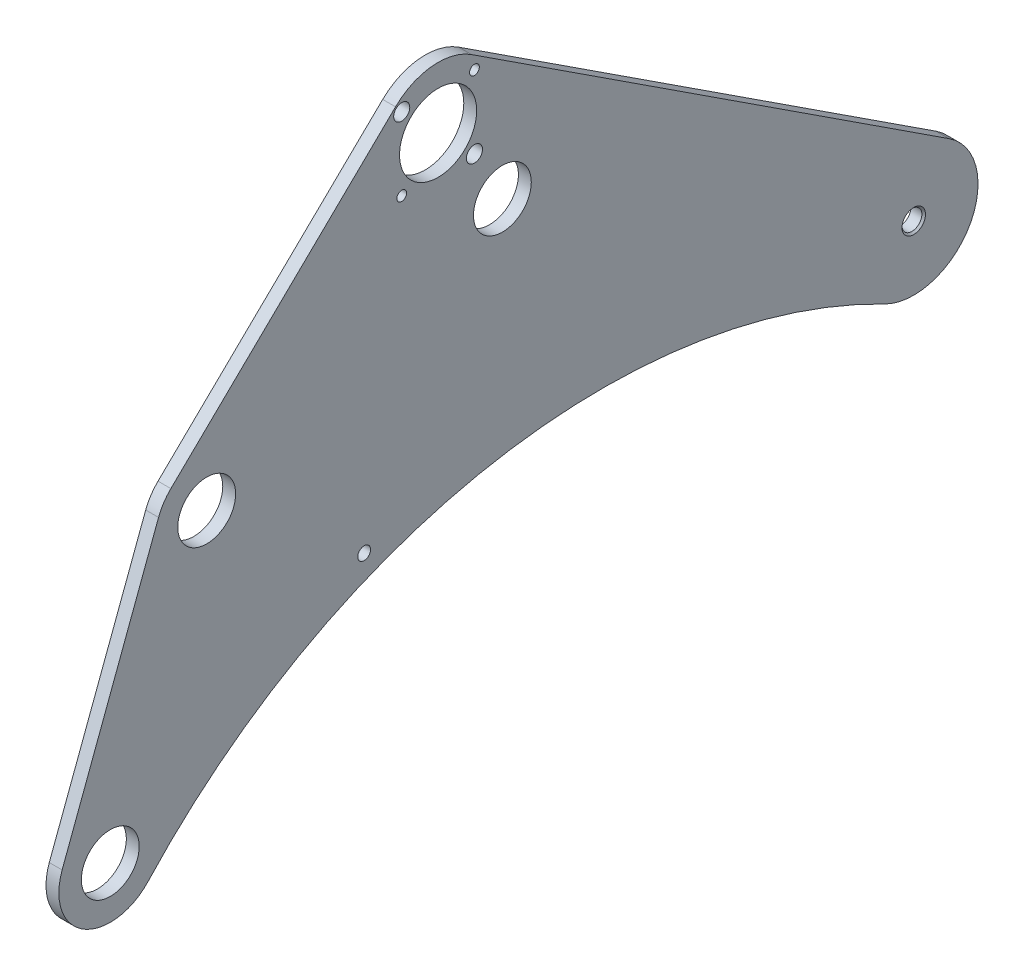
ISO-10303-21;
HEADER;
FILE_DESCRIPTION(('STEP AP214'),'2;1');
FILE_NAME('part.step','',(''),(''),'','','');
FILE_SCHEMA(('AUTOMOTIVE_DESIGN { 1 0 10303 214 1 1 1 1 }'));
ENDSEC;
DATA;
#1=APPLICATION_CONTEXT('core data for automotive mechanical design processes');
#2=APPLICATION_PROTOCOL_DEFINITION('international standard','automotive_design',2000,#1);
#3=PRODUCT_CONTEXT('',#1,'mechanical');
#4=PRODUCT('Part','Part','',(#3));
#5=PRODUCT_RELATED_PRODUCT_CATEGORY('part','',(#4));
#6=PRODUCT_DEFINITION_FORMATION('','',#4);
#7=PRODUCT_DEFINITION_CONTEXT('part definition',#1,'design');
#8=PRODUCT_DEFINITION('design','',#6,#7);
#9=PRODUCT_DEFINITION_SHAPE('','',#8);
#10=(LENGTH_UNIT() NAMED_UNIT(*) SI_UNIT(.MILLI.,.METRE.));
#11=(NAMED_UNIT(*) PLANE_ANGLE_UNIT() SI_UNIT($,.RADIAN.));
#12=(NAMED_UNIT(*) SI_UNIT($,.STERADIAN.) SOLID_ANGLE_UNIT());
#13=UNCERTAINTY_MEASURE_WITH_UNIT(LENGTH_MEASURE(1.E-05),#10,'distance_accuracy_value','');
#14=(GEOMETRIC_REPRESENTATION_CONTEXT(3) GLOBAL_UNCERTAINTY_ASSIGNED_CONTEXT((#13)) GLOBAL_UNIT_ASSIGNED_CONTEXT((#10,
#11,#12)) REPRESENTATION_CONTEXT('',''));
#15=CARTESIAN_POINT('',(0.,0.,0.));
#16=DIRECTION('',(0.,0.,1.));
#17=DIRECTION('',(1.,0.,0.));
#18=AXIS2_PLACEMENT_3D('',#15,#16,#17);
#19=CARTESIAN_POINT('',(6.35,0.,0.));
#20=DIRECTION('',(-1.,0.,0.));
#21=DIRECTION('',(0.,0.,1.));
#22=AXIS2_PLACEMENT_3D('',#19,#20,#21);
#23=CYLINDRICAL_SURFACE('',#22,31.75);
#24=CARTESIAN_POINT('',(0.,0.,0.));
#25=DIRECTION('',(1.,0.,0.));
#26=DIRECTION('',(0.,0.,-1.));
#27=AXIS2_PLACEMENT_3D('',#24,#25,#26);
#28=CIRCLE('',#27,31.75);
#29=CARTESIAN_POINT('',(0.,-28.250874568147,14.4896717055573));
#30=VERTEX_POINT('',#29);
#31=CARTESIAN_POINT('',(0.,26.5905001953675,-17.3495763452644));
#32=VERTEX_POINT('',#31);
#33=EDGE_CURVE('E129',#30,#32,#28,.T.);
#34=ORIENTED_EDGE('',*,*,#33,.T.);
#35=DIRECTION('',(-1.,0.,0.));
#36=VECTOR('',#35,1.);
#37=CARTESIAN_POINT('',(6.35,26.5905001953675,-17.3495763452644));
#38=LINE('',#37,#36);
#39=CARTESIAN_POINT('',(6.35,26.5905001953675,-17.3495763452644));
#40=VERTEX_POINT('',#39);
#41=EDGE_CURVE('E11',#40,#32,#38,.T.);
#42=ORIENTED_EDGE('',*,*,#41,.F.);
#43=CARTESIAN_POINT('',(6.35,0.,0.));
#44=DIRECTION('',(1.,0.,0.));
#45=DIRECTION('',(0.,0.,-1.));
#46=AXIS2_PLACEMENT_3D('',#43,#44,#45);
#47=CIRCLE('',#46,31.75);
#48=CARTESIAN_POINT('',(6.35,-28.250874568147,14.4896717055573));
#49=VERTEX_POINT('',#48);
#50=EDGE_CURVE('E144',#49,#40,#47,.T.);
#51=ORIENTED_EDGE('',*,*,#50,.F.);
#52=DIRECTION('',(-1.,0.,0.));
#53=VECTOR('',#52,1.);
#54=CARTESIAN_POINT('',(6.35,-28.250874568147,14.4896717055573));
#55=LINE('',#54,#53);
#56=EDGE_CURVE('E125',#49,#30,#55,.T.);
#57=ORIENTED_EDGE('',*,*,#56,.T.);
#58=EDGE_LOOP('',(#34,#42,#51,#57));
#59=FACE_BOUND('',#58,.T.);
#60=ADVANCED_FACE('F33',(#59),#23,.T.);
#61=CARTESIAN_POINT('',(6.35,180.454975185599,218.467902471999));
#62=DIRECTION('',(0.,-0.837496069145435,0.546443349457147));
#63=DIRECTION('',(0.,-0.546443349457147,-0.837496069145435));
#64=AXIS2_PLACEMENT_3D('',#61,#62,#63);
#65=PLANE('',#64);
#66=DIRECTION('',(0.,0.546443349457147,0.837496069145435));
#67=VECTOR('',#66,1.);
#68=CARTESIAN_POINT('',(0.,180.454975185599,218.467902471999));
#69=LINE('',#68,#67);
#70=CARTESIAN_POINT('',(0.,180.454975185599,218.467902471999));
#71=VERTEX_POINT('',#70);
#72=EDGE_CURVE('E132',#32,#71,#69,.T.);
#73=ORIENTED_EDGE('',*,*,#72,.T.);
#74=DIRECTION('',(-1.,0.,0.));
#75=VECTOR('',#74,1.);
#76=CARTESIAN_POINT('',(6.35,180.454975185599,218.467902471999));
#77=LINE('',#76,#75);
#78=CARTESIAN_POINT('',(6.35,180.454975185599,218.467902471999));
#79=VERTEX_POINT('',#78);
#80=EDGE_CURVE('E41',#79,#71,#77,.T.);
#81=ORIENTED_EDGE('',*,*,#80,.F.);
#82=DIRECTION('',(0.,0.546443349457147,0.837496069145435));
#83=VECTOR('',#82,1.);
#84=CARTESIAN_POINT('',(6.35,180.454975185599,218.467902471999));
#85=LINE('',#84,#83);
#86=EDGE_CURVE('E92',#40,#79,#85,.T.);
#87=ORIENTED_EDGE('',*,*,#86,.F.);
#88=ORIENTED_EDGE('',*,*,#41,.T.);
#89=EDGE_LOOP('',(#73,#81,#87,#88));
#90=FACE_BOUND('',#89,.T.);
#91=ADVANCED_FACE('F279',(#90),#65,.F.);
#92=CARTESIAN_POINT('',(6.35,155.194,234.95));
#93=DIRECTION('',(-1.,0.,0.));
#94=DIRECTION('',(0.,0.,1.));
#95=AXIS2_PLACEMENT_3D('',#92,#93,#94);
#96=CYLINDRICAL_SURFACE('',#95,30.1625);
#97=CARTESIAN_POINT('',(0.,155.194,234.95));
#98=DIRECTION('',(1.,0.,0.));
#99=DIRECTION('',(0.,0.,-1.));
#100=AXIS2_PLACEMENT_3D('',#97,#98,#99);
#101=CIRCLE('',#100,30.1625);
#102=CARTESIAN_POINT('',(0.,176.828999095109,255.966736673533));
#103=VERTEX_POINT('',#102);
#104=EDGE_CURVE('E135',#71,#103,#101,.T.);
#105=ORIENTED_EDGE('',*,*,#104,.T.);
#106=DIRECTION('',(-1.,0.,0.));
#107=VECTOR('',#106,1.);
#108=CARTESIAN_POINT('',(6.35,176.828999095109,255.966736673533));
#109=LINE('',#108,#107);
#110=CARTESIAN_POINT('',(6.35,176.828999095109,255.966736673533));
#111=VERTEX_POINT('',#110);
#112=EDGE_CURVE('E151',#111,#103,#109,.T.);
#113=ORIENTED_EDGE('',*,*,#112,.F.);
#114=CARTESIAN_POINT('',(6.35,155.194,234.95));
#115=DIRECTION('',(1.,0.,0.));
#116=DIRECTION('',(0.,0.,-1.));
#117=AXIS2_PLACEMENT_3D('',#114,#115,#116);
#118=CIRCLE('',#117,30.1625);
#119=EDGE_CURVE('E159',#79,#111,#118,.T.);
#120=ORIENTED_EDGE('',*,*,#119,.F.);
#121=ORIENTED_EDGE('',*,*,#80,.T.);
#122=EDGE_LOOP('',(#105,#113,#120,#121));
#123=FACE_BOUND('',#122,.T.);
#124=ADVANCED_FACE('F157',(#123),#96,.T.);
#125=CARTESIAN_POINT('',(6.35,69.0189466064077,366.948304567186));
#126=DIRECTION('',(0.,-0.717281362456996,-0.696783644377389));
#127=DIRECTION('',(0.,0.696783644377389,-0.717281362456996));
#128=AXIS2_PLACEMENT_3D('',#125,#126,#127);
#129=PLANE('',#128);
#130=DIRECTION('',(0.,-0.696783644377389,0.717281362456996));
#131=VECTOR('',#130,1.);
#132=CARTESIAN_POINT('',(0.,69.0189466064077,366.948304567186));
#133=LINE('',#132,#131);
#134=CARTESIAN_POINT('',(0.,69.0189466064077,366.948304567186));
#135=VERTEX_POINT('',#134);
#136=EDGE_CURVE('E137',#103,#135,#133,.T.);
#137=ORIENTED_EDGE('',*,*,#136,.T.);
#138=DIRECTION('',(-1.,0.,0.));
#139=VECTOR('',#138,1.);
#140=CARTESIAN_POINT('',(6.35,69.0189466064077,366.948304567186));
#141=LINE('',#140,#139);
#142=CARTESIAN_POINT('',(6.35,69.0189466064077,366.948304567186));
#143=VERTEX_POINT('',#142);
#144=EDGE_CURVE('E148',#143,#135,#141,.T.);
#145=ORIENTED_EDGE('',*,*,#144,.F.);
#146=DIRECTION('',(0.,-0.696783644377389,0.717281362456996));
#147=VECTOR('',#146,1.);
#148=CARTESIAN_POINT('',(6.35,69.0189466064077,366.948304567186));
#149=LINE('',#148,#147);
#150=EDGE_CURVE('E171',#111,#143,#149,.T.);
#151=ORIENTED_EDGE('',*,*,#150,.F.);
#152=ORIENTED_EDGE('',*,*,#112,.T.);
#153=EDGE_LOOP('',(#137,#145,#151,#152));
#154=FACE_BOUND('',#153,.T.);
#155=ADVANCED_FACE('F167',(#154),#129,.F.);
#156=CARTESIAN_POINT('',(6.35,50.8,349.25));
#157=DIRECTION('',(-1.,0.,0.));
#158=DIRECTION('',(0.,0.,1.));
#159=AXIS2_PLACEMENT_3D('',#156,#157,#158);
#160=CYLINDRICAL_SURFACE('',#159,25.3999999999999);
#161=CARTESIAN_POINT('',(0.,50.8,349.25));
#162=DIRECTION('',(1.,0.,0.));
#163=DIRECTION('',(0.,0.,-1.));
#164=AXIS2_PLACEMENT_3D('',#161,#162,#163);
#165=CIRCLE('',#164,25.3999999999999);
#166=CARTESIAN_POINT('',(0.,59.7185354163451,373.032761110254));
#167=VERTEX_POINT('',#166);
#168=EDGE_CURVE('E139',#135,#167,#165,.T.);
#169=ORIENTED_EDGE('',*,*,#168,.T.);
#170=DIRECTION('',(-1.,0.,0.));
#171=VECTOR('',#170,1.);
#172=CARTESIAN_POINT('',(6.35,59.7185354163451,373.032761110254));
#173=LINE('',#172,#171);
#174=CARTESIAN_POINT('',(6.35,59.7185354163451,373.032761110254));
#175=VERTEX_POINT('',#174);
#176=EDGE_CURVE('E120',#175,#167,#173,.T.);
#177=ORIENTED_EDGE('',*,*,#176,.F.);
#178=CARTESIAN_POINT('',(6.35,50.8,349.25));
#179=DIRECTION('',(1.,0.,0.));
#180=DIRECTION('',(0.,0.,-1.));
#181=AXIS2_PLACEMENT_3D('',#178,#179,#180);
#182=CIRCLE('',#181,25.3999999999999);
#183=EDGE_CURVE('E111',#143,#175,#182,.T.);
#184=ORIENTED_EDGE('',*,*,#183,.F.);
#185=ORIENTED_EDGE('',*,*,#144,.T.);
#186=EDGE_LOOP('',(#169,#177,#184,#185));
#187=FACE_BOUND('',#186,.T.);
#188=ADVANCED_FACE('F170',(#187),#160,.T.);
#189=CARTESIAN_POINT('',(6.35,-67.2814645836549,420.657761110254));
#190=DIRECTION('',(0.,-0.351123441588392,-0.936329177569044));
#191=DIRECTION('',(0.,0.936329177569045,-0.351123441588392));
#192=AXIS2_PLACEMENT_3D('',#189,#190,#191);
#193=PLANE('',#192);
#194=DIRECTION('',(0.,-0.936329177569045,0.351123441588392));
#195=VECTOR('',#194,1.);
#196=CARTESIAN_POINT('',(0.,-67.2814645836549,420.657761110254));
#197=LINE('',#196,#195);
#198=CARTESIAN_POINT('',(0.,-67.2814645836549,420.657761110254));
#199=VERTEX_POINT('',#198);
#200=EDGE_CURVE('E119',#167,#199,#197,.T.);
#201=ORIENTED_EDGE('',*,*,#200,.T.);
#202=DIRECTION('',(-1.,0.,0.));
#203=VECTOR('',#202,1.);
#204=CARTESIAN_POINT('',(6.35,-67.2814645836549,420.657761110254));
#205=LINE('',#204,#203);
#206=CARTESIAN_POINT('',(6.35,-67.2814645836549,420.657761110254));
#207=VERTEX_POINT('',#206);
#208=EDGE_CURVE('E116',#207,#199,#205,.T.);
#209=ORIENTED_EDGE('',*,*,#208,.F.);
#210=DIRECTION('',(0.,-0.936329177569045,0.351123441588392));
#211=VECTOR('',#210,1.);
#212=CARTESIAN_POINT('',(6.35,-67.2814645836549,420.657761110254));
#213=LINE('',#212,#211);
#214=EDGE_CURVE('E105',#175,#207,#213,.T.);
#215=ORIENTED_EDGE('',*,*,#214,.F.);
#216=ORIENTED_EDGE('',*,*,#176,.T.);
#217=EDGE_LOOP('',(#201,#209,#215,#216));
#218=FACE_BOUND('',#217,.T.);
#219=ADVANCED_FACE('F117',(#218),#193,.F.);
#220=CARTESIAN_POINT('',(6.35,-76.2,396.875));
#221=DIRECTION('',(-1.,0.,0.));
#222=DIRECTION('',(0.,0.,1.));
#223=AXIS2_PLACEMENT_3D('',#220,#221,#222);
#224=CYLINDRICAL_SURFACE('',#223,25.4);
#225=CARTESIAN_POINT('',(0.,-76.2,396.875));
#226=DIRECTION('',(1.,0.,0.));
#227=DIRECTION('',(0.,0.,-1.));
#228=AXIS2_PLACEMENT_3D('',#225,#226,#227);
#229=CIRCLE('',#228,25.4);
#230=CARTESIAN_POINT('',(0.,-93.373790032489,378.160809236839));
#231=VERTEX_POINT('',#230);
#232=EDGE_CURVE('E78',#199,#231,#229,.T.);
#233=ORIENTED_EDGE('',*,*,#232,.T.);
#234=DIRECTION('',(-1.,0.,0.));
#235=VECTOR('',#234,1.);
#236=CARTESIAN_POINT('',(6.35,-93.373790032489,378.160809236839));
#237=LINE('',#236,#235);
#238=CARTESIAN_POINT('',(6.35,-93.373790032489,378.160809236839));
#239=VERTEX_POINT('',#238);
#240=EDGE_CURVE('E121',#239,#231,#237,.T.);
#241=ORIENTED_EDGE('',*,*,#240,.F.);
#242=CARTESIAN_POINT('',(6.35,-76.2,396.875));
#243=DIRECTION('',(1.,0.,0.));
#244=DIRECTION('',(0.,0.,-1.));
#245=AXIS2_PLACEMENT_3D('',#242,#243,#244);
#246=CIRCLE('',#245,25.4);
#247=EDGE_CURVE('E109',#207,#239,#246,.T.);
#248=ORIENTED_EDGE('',*,*,#247,.F.);
#249=ORIENTED_EDGE('',*,*,#208,.T.);
#250=EDGE_LOOP('',(#233,#241,#248,#249));
#251=FACE_BOUND('',#250,.T.);
#252=ADVANCED_FACE('F123',(#251),#224,.T.);
#253=CARTESIAN_POINT('',(6.35,-299.459270422358,153.590520078907));
#254=DIRECTION('',(-1.,0.,0.));
#255=DIRECTION('',(0.,0.,1.));
#256=AXIS2_PLACEMENT_3D('',#253,#254,#255);
#257=CYLINDRICAL_SURFACE('',#256,304.8);
#258=CARTESIAN_POINT('',(0.,-299.459270422358,153.590520078907));
#259=DIRECTION('',(-1.,0.,0.));
#260=DIRECTION('',(0.,0.,1.));
#261=AXIS2_PLACEMENT_3D('',#258,#259,#260);
#262=CIRCLE('',#261,304.8);
#263=EDGE_CURVE('E84',#231,#30,#262,.T.);
#264=ORIENTED_EDGE('',*,*,#263,.T.);
#265=ORIENTED_EDGE('',*,*,#56,.F.);
#266=CARTESIAN_POINT('',(6.35,-299.459270422358,153.590520078907));
#267=DIRECTION('',(-1.,0.,0.));
#268=DIRECTION('',(0.,0.,1.));
#269=AXIS2_PLACEMENT_3D('',#266,#267,#268);
#270=CIRCLE('',#269,304.8);
#271=EDGE_CURVE('E49',#239,#49,#270,.T.);
#272=ORIENTED_EDGE('',*,*,#271,.F.);
#273=ORIENTED_EDGE('',*,*,#240,.T.);
#274=EDGE_LOOP('',(#264,#265,#272,#273));
#275=FACE_BOUND('',#274,.T.);
#276=ADVANCED_FACE('F244',(#275),#257,.F.);
#277=CARTESIAN_POINT('',(6.35,0.,0.));
#278=DIRECTION('',(1.,0.,0.));
#279=DIRECTION('',(0.,0.,-1.));
#280=AXIS2_PLACEMENT_3D('',#277,#278,#279);
#281=PLANE('',#280);
#282=CARTESIAN_POINT('',(6.35,-6.35,271.4625));
#283=DIRECTION('',(1.,0.,0.));
#284=DIRECTION('',(0.,0.,-1.));
#285=AXIS2_PLACEMENT_3D('',#282,#283,#284);
#286=CIRCLE('',#285,3.175);
#287=CARTESIAN_POINT('',(6.35,-6.35,268.2875));
#288=VERTEX_POINT('',#287);
#289=EDGE_CURVE('E236',#288,#288,#286,.T.);
#290=ORIENTED_EDGE('',*,*,#289,.F.);
#291=EDGE_LOOP('',(#290));
#292=FACE_BOUND('',#291,.T.);
#293=CARTESIAN_POINT('',(6.35,0.,0.));
#294=DIRECTION('',(1.,0.,0.));
#295=DIRECTION('',(0.,0.,-1.));
#296=AXIS2_PLACEMENT_3D('',#293,#294,#295);
#297=CIRCLE('',#296,5.79374);
#298=CARTESIAN_POINT('',(6.35,0.,-5.79374));
#299=VERTEX_POINT('',#298);
#300=EDGE_CURVE('E230',#299,#299,#297,.T.);
#301=ORIENTED_EDGE('',*,*,#300,.F.);
#302=EDGE_LOOP('',(#301));
#303=FACE_BOUND('',#302,.T.);
#304=CARTESIAN_POINT('',(6.35,50.8,349.25));
#305=DIRECTION('',(1.,0.,0.));
#306=DIRECTION('',(0.,0.,-1.));
#307=AXIS2_PLACEMENT_3D('',#304,#305,#306);
#308=CIRCLE('',#307,14.2875);
#309=CARTESIAN_POINT('',(6.35,50.8,334.9625));
#310=VERTEX_POINT('',#309);
#311=EDGE_CURVE('E200',#310,#310,#308,.T.);
#312=ORIENTED_EDGE('',*,*,#311,.F.);
#313=EDGE_LOOP('',(#312));
#314=FACE_BOUND('',#313,.T.);
#315=CARTESIAN_POINT('',(6.35,-76.2,396.875));
#316=DIRECTION('',(1.,0.,0.));
#317=DIRECTION('',(0.,0.,-1.));
#318=AXIS2_PLACEMENT_3D('',#315,#316,#317);
#319=CIRCLE('',#318,14.2875);
#320=CARTESIAN_POINT('',(6.35,-76.2,382.5875));
#321=VERTEX_POINT('',#320);
#322=EDGE_CURVE('E186',#321,#321,#319,.T.);
#323=ORIENTED_EDGE('',*,*,#322,.F.);
#324=EDGE_LOOP('',(#323));
#325=FACE_BOUND('',#324,.T.);
#326=CARTESIAN_POINT('',(6.35,137.233487757862,252.910512242138));
#327=DIRECTION('',(1.,0.,0.));
#328=DIRECTION('',(0.,0.,-1.));
#329=AXIS2_PLACEMENT_3D('',#326,#327,#328);
#330=CIRCLE('',#329,2.41300000000034);
#331=CARTESIAN_POINT('',(6.35,137.233487757862,250.497512242138));
#332=VERTEX_POINT('',#331);
#333=EDGE_CURVE('E193',#332,#332,#330,.T.);
#334=ORIENTED_EDGE('',*,*,#333,.F.);
#335=EDGE_LOOP('',(#334));
#336=FACE_BOUND('',#335,.T.);
#337=CARTESIAN_POINT('',(6.35,155.194,234.95));
#338=DIRECTION('',(1.,0.,0.));
#339=DIRECTION('',(0.,0.,-1.));
#340=AXIS2_PLACEMENT_3D('',#337,#338,#339);
#341=CIRCLE('',#340,19.05);
#342=CARTESIAN_POINT('',(6.35,155.194,215.9));
#343=VERTEX_POINT('',#342);
#344=EDGE_CURVE('E187',#343,#343,#341,.T.);
#345=ORIENTED_EDGE('',*,*,#344,.F.);
#346=EDGE_LOOP('',(#345));
#347=FACE_BOUND('',#346,.T.);
#348=CARTESIAN_POINT('',(6.35,173.154512242138,216.989487757862));
#349=DIRECTION('',(1.,0.,0.));
#350=DIRECTION('',(0.,0.,-1.));
#351=AXIS2_PLACEMENT_3D('',#348,#349,#350);
#352=CIRCLE('',#351,2.41300000000031);
#353=CARTESIAN_POINT('',(6.35,173.154512242138,214.576487757862));
#354=VERTEX_POINT('',#353);
#355=EDGE_CURVE('E218',#354,#354,#352,.T.);
#356=ORIENTED_EDGE('',*,*,#355,.F.);
#357=EDGE_LOOP('',(#356));
#358=FACE_BOUND('',#357,.T.);
#359=CARTESIAN_POINT('',(6.35,173.154512242138,252.910512242138));
#360=DIRECTION('',(1.,0.,0.));
#361=DIRECTION('',(0.,0.,-1.));
#362=AXIS2_PLACEMENT_3D('',#359,#360,#361);
#363=CIRCLE('',#362,3.96874999999999);
#364=CARTESIAN_POINT('',(6.35,173.154512242138,248.941762242138));
#365=VERTEX_POINT('',#364);
#366=EDGE_CURVE('E210',#365,#365,#363,.T.);
#367=ORIENTED_EDGE('',*,*,#366,.F.);
#368=EDGE_LOOP('',(#367));
#369=FACE_BOUND('',#368,.T.);
#370=CARTESIAN_POINT('',(6.35,137.233487757862,216.989487757862));
#371=DIRECTION('',(1.,0.,0.));
#372=DIRECTION('',(0.,0.,-1.));
#373=AXIS2_PLACEMENT_3D('',#370,#371,#372);
#374=CIRCLE('',#373,3.96874999999999);
#375=CARTESIAN_POINT('',(6.35,137.233487757862,213.020737757862));
#376=VERTEX_POINT('',#375);
#377=EDGE_CURVE('E211',#376,#376,#374,.T.);
#378=ORIENTED_EDGE('',*,*,#377,.F.);
#379=EDGE_LOOP('',(#378));
#380=FACE_BOUND('',#379,.T.);
#381=CARTESIAN_POINT('',(6.35,111.125,203.2));
#382=DIRECTION('',(1.,0.,0.));
#383=DIRECTION('',(0.,0.,-1.));
#384=AXIS2_PLACEMENT_3D('',#381,#382,#383);
#385=CIRCLE('',#384,14.2875);
#386=CARTESIAN_POINT('',(6.35,111.125,188.9125));
#387=VERTEX_POINT('',#386);
#388=EDGE_CURVE('E179',#387,#387,#385,.T.);
#389=ORIENTED_EDGE('',*,*,#388,.F.);
#390=EDGE_LOOP('',(#389));
#391=FACE_BOUND('',#390,.T.);
#392=ORIENTED_EDGE('',*,*,#50,.T.);
#393=ORIENTED_EDGE('',*,*,#86,.T.);
#394=ORIENTED_EDGE('',*,*,#119,.T.);
#395=ORIENTED_EDGE('',*,*,#150,.T.);
#396=ORIENTED_EDGE('',*,*,#183,.T.);
#397=ORIENTED_EDGE('',*,*,#214,.T.);
#398=ORIENTED_EDGE('',*,*,#247,.T.);
#399=ORIENTED_EDGE('',*,*,#271,.T.);
#400=EDGE_LOOP('',(#392,#393,#394,#395,#396,#397,#398,#399));
#401=FACE_BOUND('',#400,.T.);
#402=ADVANCED_FACE('F107',(#292,#303,#314,#325,#336,#347,#358,#369,#380,#391,#401),#281,.T.);
#403=CARTESIAN_POINT('',(0.,0.,0.));
#404=DIRECTION('',(1.,0.,0.));
#405=DIRECTION('',(0.,0.,-1.));
#406=AXIS2_PLACEMENT_3D('',#403,#404,#405);
#407=PLANE('',#406);
#408=CARTESIAN_POINT('',(0.,-6.35,271.4625));
#409=DIRECTION('',(1.,0.,0.));
#410=DIRECTION('',(0.,0.,-1.));
#411=AXIS2_PLACEMENT_3D('',#408,#409,#410);
#412=CIRCLE('',#411,3.175);
#413=CARTESIAN_POINT('',(0.,-6.35,268.2875));
#414=VERTEX_POINT('',#413);
#415=EDGE_CURVE('E233',#414,#414,#412,.T.);
#416=ORIENTED_EDGE('',*,*,#415,.T.);
#417=EDGE_LOOP('',(#416));
#418=FACE_BOUND('',#417,.T.);
#419=CARTESIAN_POINT('',(0.,0.,0.));
#420=DIRECTION('',(1.,0.,0.));
#421=DIRECTION('',(0.,0.,-1.));
#422=AXIS2_PLACEMENT_3D('',#419,#420,#421);
#423=CIRCLE('',#422,4.9022);
#424=CARTESIAN_POINT('',(0.,0.,-4.9022));
#425=VERTEX_POINT('',#424);
#426=EDGE_CURVE('E214',#425,#425,#423,.T.);
#427=ORIENTED_EDGE('',*,*,#426,.T.);
#428=EDGE_LOOP('',(#427));
#429=FACE_BOUND('',#428,.T.);
#430=CARTESIAN_POINT('',(0.,50.8,349.25));
#431=DIRECTION('',(1.,0.,0.));
#432=DIRECTION('',(0.,0.,-1.));
#433=AXIS2_PLACEMENT_3D('',#430,#431,#432);
#434=CIRCLE('',#433,14.2875);
#435=CARTESIAN_POINT('',(0.,50.8,334.9625));
#436=VERTEX_POINT('',#435);
#437=EDGE_CURVE('E182',#436,#436,#434,.F.);
#438=ORIENTED_EDGE('',*,*,#437,.F.);
#439=EDGE_LOOP('',(#438));
#440=FACE_BOUND('',#439,.T.);
#441=CARTESIAN_POINT('',(0.,-76.2,396.875));
#442=DIRECTION('',(1.,0.,0.));
#443=DIRECTION('',(0.,0.,-1.));
#444=AXIS2_PLACEMENT_3D('',#441,#442,#443);
#445=CIRCLE('',#444,14.2875);
#446=CARTESIAN_POINT('',(0.,-76.2,382.5875));
#447=VERTEX_POINT('',#446);
#448=EDGE_CURVE('E197',#447,#447,#445,.F.);
#449=ORIENTED_EDGE('',*,*,#448,.F.);
#450=EDGE_LOOP('',(#449));
#451=FACE_BOUND('',#450,.T.);
#452=CARTESIAN_POINT('',(0.,137.233487757862,252.910512242138));
#453=DIRECTION('',(1.,0.,0.));
#454=DIRECTION('',(0.,0.,-1.));
#455=AXIS2_PLACEMENT_3D('',#452,#453,#454);
#456=CIRCLE('',#455,2.41300000000034);
#457=CARTESIAN_POINT('',(0.,137.233487757862,250.497512242138));
#458=VERTEX_POINT('',#457);
#459=EDGE_CURVE('E190',#458,#458,#456,.F.);
#460=ORIENTED_EDGE('',*,*,#459,.F.);
#461=EDGE_LOOP('',(#460));
#462=FACE_BOUND('',#461,.T.);
#463=CARTESIAN_POINT('',(0.,155.194,234.95));
#464=DIRECTION('',(1.,0.,0.));
#465=DIRECTION('',(0.,0.,-1.));
#466=AXIS2_PLACEMENT_3D('',#463,#464,#465);
#467=CIRCLE('',#466,19.05);
#468=CARTESIAN_POINT('',(0.,155.194,215.9));
#469=VERTEX_POINT('',#468);
#470=EDGE_CURVE('E183',#469,#469,#467,.F.);
#471=ORIENTED_EDGE('',*,*,#470,.F.);
#472=EDGE_LOOP('',(#471));
#473=FACE_BOUND('',#472,.T.);
#474=CARTESIAN_POINT('',(0.,173.154512242138,216.989487757862));
#475=DIRECTION('',(1.,0.,0.));
#476=DIRECTION('',(0.,0.,-1.));
#477=AXIS2_PLACEMENT_3D('',#474,#475,#476);
#478=CIRCLE('',#477,2.41300000000031);
#479=CARTESIAN_POINT('',(0.,173.154512242138,214.576487757862));
#480=VERTEX_POINT('',#479);
#481=EDGE_CURVE('E196',#480,#480,#478,.F.);
#482=ORIENTED_EDGE('',*,*,#481,.F.);
#483=EDGE_LOOP('',(#482));
#484=FACE_BOUND('',#483,.T.);
#485=CARTESIAN_POINT('',(0.,173.154512242138,252.910512242138));
#486=DIRECTION('',(1.,0.,0.));
#487=DIRECTION('',(0.,0.,-1.));
#488=AXIS2_PLACEMENT_3D('',#485,#486,#487);
#489=CIRCLE('',#488,3.96874999999999);
#490=CARTESIAN_POINT('',(0.,173.154512242138,248.941762242138));
#491=VERTEX_POINT('',#490);
#492=EDGE_CURVE('E215',#491,#491,#489,.F.);
#493=ORIENTED_EDGE('',*,*,#492,.F.);
#494=EDGE_LOOP('',(#493));
#495=FACE_BOUND('',#494,.T.);
#496=CARTESIAN_POINT('',(0.,137.233487757862,216.989487757862));
#497=DIRECTION('',(1.,0.,0.));
#498=DIRECTION('',(0.,0.,-1.));
#499=AXIS2_PLACEMENT_3D('',#496,#497,#498);
#500=CIRCLE('',#499,3.96874999999999);
#501=CARTESIAN_POINT('',(0.,137.233487757862,213.020737757862));
#502=VERTEX_POINT('',#501);
#503=EDGE_CURVE('E207',#502,#502,#500,.F.);
#504=ORIENTED_EDGE('',*,*,#503,.F.);
#505=EDGE_LOOP('',(#504));
#506=FACE_BOUND('',#505,.T.);
#507=CARTESIAN_POINT('',(0.,111.125,203.2));
#508=DIRECTION('',(1.,0.,0.));
#509=DIRECTION('',(0.,0.,-1.));
#510=AXIS2_PLACEMENT_3D('',#507,#508,#509);
#511=CIRCLE('',#510,14.2875);
#512=CARTESIAN_POINT('',(0.,111.125,188.9125));
#513=VERTEX_POINT('',#512);
#514=EDGE_CURVE('E133',#513,#513,#511,.F.);
#515=ORIENTED_EDGE('',*,*,#514,.F.);
#516=EDGE_LOOP('',(#515));
#517=FACE_BOUND('',#516,.T.);
#518=ORIENTED_EDGE('',*,*,#33,.F.);
#519=ORIENTED_EDGE('',*,*,#263,.F.);
#520=ORIENTED_EDGE('',*,*,#232,.F.);
#521=ORIENTED_EDGE('',*,*,#200,.F.);
#522=ORIENTED_EDGE('',*,*,#168,.F.);
#523=ORIENTED_EDGE('',*,*,#136,.F.);
#524=ORIENTED_EDGE('',*,*,#104,.F.);
#525=ORIENTED_EDGE('',*,*,#72,.F.);
#526=EDGE_LOOP('',(#518,#519,#520,#521,#522,#523,#524,#525));
#527=FACE_BOUND('',#526,.T.);
#528=ADVANCED_FACE('F163',(#418,#429,#440,#451,#462,#473,#484,#495,#506,#517,#527),#407,.F.);
#529=CARTESIAN_POINT('',(-0.00100000000000013,111.125,203.2));
#530=DIRECTION('',(1.,0.,0.));
#531=DIRECTION('',(0.,0.,-1.));
#532=AXIS2_PLACEMENT_3D('',#529,#530,#531);
#533=CYLINDRICAL_SURFACE('',#532,14.2875);
#534=ORIENTED_EDGE('',*,*,#388,.T.);
#535=EDGE_LOOP('',(#534));
#536=FACE_BOUND('',#535,.T.);
#537=ORIENTED_EDGE('',*,*,#514,.T.);
#538=EDGE_LOOP('',(#537));
#539=FACE_BOUND('',#538,.T.);
#540=ADVANCED_FACE('F264',(#536,#539),#533,.F.);
#541=CARTESIAN_POINT('',(-0.00100000000000013,137.233487757862,216.989487757862));
#542=DIRECTION('',(1.,0.,0.));
#543=DIRECTION('',(0.,0.,-1.));
#544=AXIS2_PLACEMENT_3D('',#541,#542,#543);
#545=CYLINDRICAL_SURFACE('',#544,3.96874999999999);
#546=ORIENTED_EDGE('',*,*,#377,.T.);
#547=EDGE_LOOP('',(#546));
#548=FACE_BOUND('',#547,.T.);
#549=ORIENTED_EDGE('',*,*,#503,.T.);
#550=EDGE_LOOP('',(#549));
#551=FACE_BOUND('',#550,.T.);
#552=ADVANCED_FACE('F267',(#548,#551),#545,.F.);
#553=CARTESIAN_POINT('',(-0.00100000000000013,173.154512242138,252.910512242138));
#554=DIRECTION('',(1.,0.,0.));
#555=DIRECTION('',(0.,0.,-1.));
#556=AXIS2_PLACEMENT_3D('',#553,#554,#555);
#557=CYLINDRICAL_SURFACE('',#556,3.96874999999999);
#558=ORIENTED_EDGE('',*,*,#366,.T.);
#559=EDGE_LOOP('',(#558));
#560=FACE_BOUND('',#559,.T.);
#561=ORIENTED_EDGE('',*,*,#492,.T.);
#562=EDGE_LOOP('',(#561));
#563=FACE_BOUND('',#562,.T.);
#564=ADVANCED_FACE('F340',(#560,#563),#557,.F.);
#565=CARTESIAN_POINT('',(-0.00100000000000013,173.154512242138,216.989487757862));
#566=DIRECTION('',(1.,0.,0.));
#567=DIRECTION('',(0.,0.,-1.));
#568=AXIS2_PLACEMENT_3D('',#565,#566,#567);
#569=CYLINDRICAL_SURFACE('',#568,2.41300000000031);
#570=ORIENTED_EDGE('',*,*,#355,.T.);
#571=EDGE_LOOP('',(#570));
#572=FACE_BOUND('',#571,.T.);
#573=ORIENTED_EDGE('',*,*,#481,.T.);
#574=EDGE_LOOP('',(#573));
#575=FACE_BOUND('',#574,.T.);
#576=ADVANCED_FACE('F350',(#572,#575),#569,.F.);
#577=CARTESIAN_POINT('',(-0.00100000000000013,155.194,234.95));
#578=DIRECTION('',(1.,0.,0.));
#579=DIRECTION('',(0.,0.,-1.));
#580=AXIS2_PLACEMENT_3D('',#577,#578,#579);
#581=CYLINDRICAL_SURFACE('',#580,19.05);
#582=ORIENTED_EDGE('',*,*,#344,.T.);
#583=EDGE_LOOP('',(#582));
#584=FACE_BOUND('',#583,.T.);
#585=ORIENTED_EDGE('',*,*,#470,.T.);
#586=EDGE_LOOP('',(#585));
#587=FACE_BOUND('',#586,.T.);
#588=ADVANCED_FACE('F360',(#584,#587),#581,.F.);
#589=CARTESIAN_POINT('',(-0.00100000000000013,137.233487757862,252.910512242138));
#590=DIRECTION('',(1.,0.,0.));
#591=DIRECTION('',(0.,0.,-1.));
#592=AXIS2_PLACEMENT_3D('',#589,#590,#591);
#593=CYLINDRICAL_SURFACE('',#592,2.41300000000034);
#594=ORIENTED_EDGE('',*,*,#333,.T.);
#595=EDGE_LOOP('',(#594));
#596=FACE_BOUND('',#595,.T.);
#597=ORIENTED_EDGE('',*,*,#459,.T.);
#598=EDGE_LOOP('',(#597));
#599=FACE_BOUND('',#598,.T.);
#600=ADVANCED_FACE('F370',(#596,#599),#593,.F.);
#601=CARTESIAN_POINT('',(-0.00100000000000013,-76.2,396.875));
#602=DIRECTION('',(1.,0.,0.));
#603=DIRECTION('',(0.,0.,-1.));
#604=AXIS2_PLACEMENT_3D('',#601,#602,#603);
#605=CYLINDRICAL_SURFACE('',#604,14.2875);
#606=ORIENTED_EDGE('',*,*,#322,.T.);
#607=EDGE_LOOP('',(#606));
#608=FACE_BOUND('',#607,.T.);
#609=ORIENTED_EDGE('',*,*,#448,.T.);
#610=EDGE_LOOP('',(#609));
#611=FACE_BOUND('',#610,.T.);
#612=ADVANCED_FACE('F380',(#608,#611),#605,.F.);
#613=CARTESIAN_POINT('',(-0.00100000000000013,50.8,349.25));
#614=DIRECTION('',(1.,0.,0.));
#615=DIRECTION('',(0.,0.,-1.));
#616=AXIS2_PLACEMENT_3D('',#613,#614,#615);
#617=CYLINDRICAL_SURFACE('',#616,14.2875);
#618=ORIENTED_EDGE('',*,*,#311,.T.);
#619=EDGE_LOOP('',(#618));
#620=FACE_BOUND('',#619,.T.);
#621=ORIENTED_EDGE('',*,*,#437,.T.);
#622=EDGE_LOOP('',(#621));
#623=FACE_BOUND('',#622,.T.);
#624=ADVANCED_FACE('F390',(#620,#623),#617,.F.);
#625=CARTESIAN_POINT('',(6.35,0.,0.));
#626=DIRECTION('',(1.,0.,0.));
#627=DIRECTION('',(0.,0.,-1.));
#628=AXIS2_PLACEMENT_3D('',#625,#626,#627);
#629=CYLINDRICAL_SURFACE('',#628,4.9022);
#630=ORIENTED_EDGE('',*,*,#426,.F.);
#631=EDGE_LOOP('',(#630));
#632=FACE_BOUND('',#631,.T.);
#633=CARTESIAN_POINT('',(5.45846,0.,0.));
#634=DIRECTION('',(1.,0.,0.));
#635=DIRECTION('',(0.,0.,-1.));
#636=AXIS2_PLACEMENT_3D('',#633,#634,#635);
#637=CIRCLE('',#636,4.9022);
#638=CARTESIAN_POINT('',(5.45846,0.,-4.9022));
#639=VERTEX_POINT('',#638);
#640=EDGE_CURVE('E227',#639,#639,#637,.T.);
#641=ORIENTED_EDGE('',*,*,#640,.T.);
#642=EDGE_LOOP('',(#641));
#643=FACE_BOUND('',#642,.T.);
#644=ADVANCED_FACE('F400',(#632,#643),#629,.F.);
#645=CARTESIAN_POINT('',(6.35,0.,0.));
#646=DIRECTION('',(1.,0.,0.));
#647=DIRECTION('',(0.,0.,-1.));
#648=AXIS2_PLACEMENT_3D('',#645,#646,#647);
#649=CONICAL_SURFACE('',#648,5.79374,0.785398163397448);
#650=ORIENTED_EDGE('',*,*,#640,.F.);
#651=EDGE_LOOP('',(#650));
#652=FACE_BOUND('',#651,.T.);
#653=ORIENTED_EDGE('',*,*,#300,.T.);
#654=EDGE_LOOP('',(#653));
#655=FACE_BOUND('',#654,.T.);
#656=ADVANCED_FACE('F410',(#652,#655),#649,.F.);
#657=CARTESIAN_POINT('',(6.35,-6.35,271.4625));
#658=DIRECTION('',(1.,0.,0.));
#659=DIRECTION('',(0.,0.,-1.));
#660=AXIS2_PLACEMENT_3D('',#657,#658,#659);
#661=CYLINDRICAL_SURFACE('',#660,3.175);
#662=ORIENTED_EDGE('',*,*,#415,.F.);
#663=EDGE_LOOP('',(#662));
#664=FACE_BOUND('',#663,.T.);
#665=ORIENTED_EDGE('',*,*,#289,.T.);
#666=EDGE_LOOP('',(#665));
#667=FACE_BOUND('',#666,.T.);
#668=ADVANCED_FACE('F240',(#664,#667),#661,.F.);
#669=CLOSED_SHELL('',(#60,#91,#124,#155,#188,#219,#252,#276,#402,#528,#540,#552,#564,#576,#588,
#600,#612,#624,#644,#656,#668));
#670=MANIFOLD_SOLID_BREP('B2',#669);
#671=ADVANCED_BREP_SHAPE_REPRESENTATION('',(#18,#670),#14);
#672=SHAPE_DEFINITION_REPRESENTATION(#9,#671);
ENDSEC;
END-ISO-10303-21;
